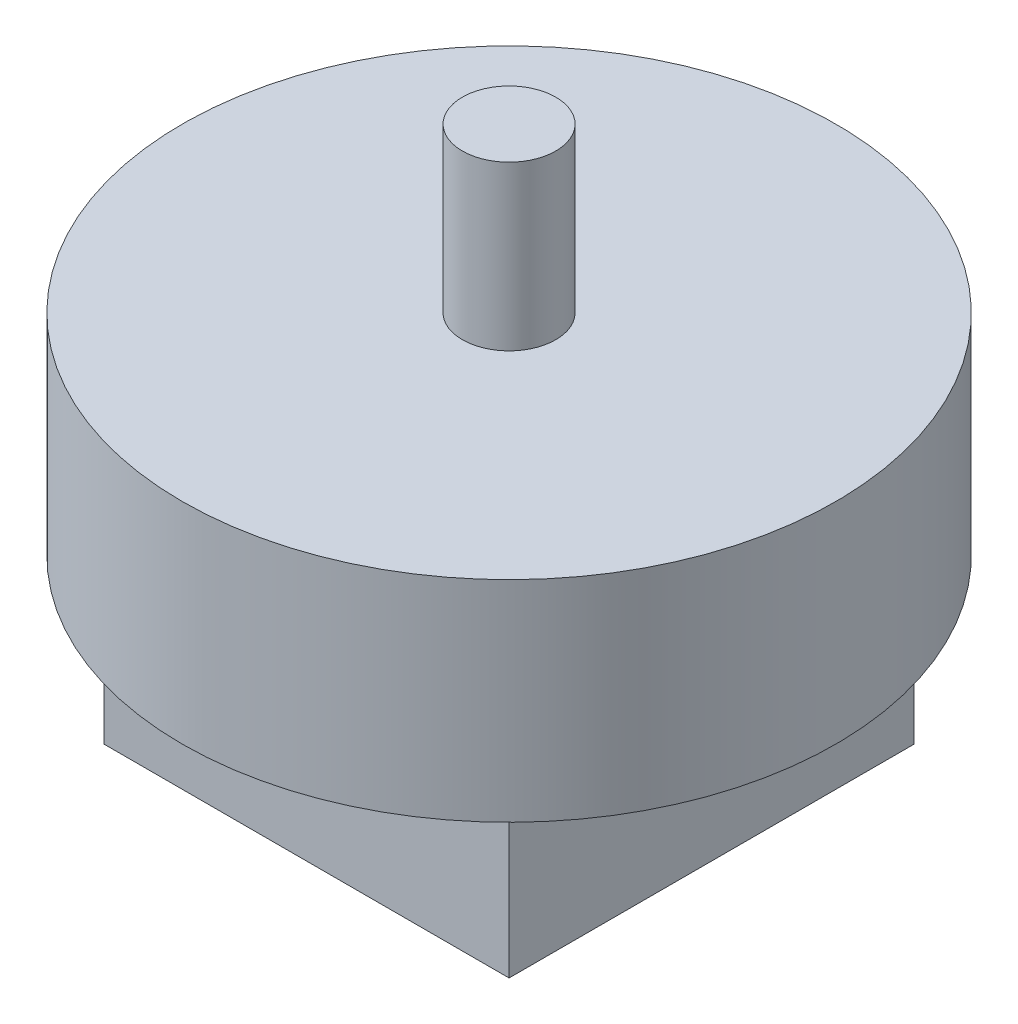
ISO-10303-21;
HEADER;
FILE_DESCRIPTION(('STEP AP214'),'2;1');
FILE_NAME('part.step','',(''),(''),'','','');
FILE_SCHEMA(('AUTOMOTIVE_DESIGN { 1 0 10303 214 1 1 1 1 }'));
ENDSEC;
DATA;
#1=APPLICATION_CONTEXT('core data for automotive mechanical design processes');
#2=APPLICATION_PROTOCOL_DEFINITION('international standard','automotive_design',2000,#1);
#3=PRODUCT_CONTEXT('',#1,'mechanical');
#4=PRODUCT('Part','Part','',(#3));
#5=PRODUCT_RELATED_PRODUCT_CATEGORY('part','',(#4));
#6=PRODUCT_DEFINITION_FORMATION('','',#4);
#7=PRODUCT_DEFINITION_CONTEXT('part definition',#1,'design');
#8=PRODUCT_DEFINITION('design','',#6,#7);
#9=PRODUCT_DEFINITION_SHAPE('','',#8);
#10=(LENGTH_UNIT() NAMED_UNIT(*) SI_UNIT(.MILLI.,.METRE.));
#11=(NAMED_UNIT(*) PLANE_ANGLE_UNIT() SI_UNIT($,.RADIAN.));
#12=(NAMED_UNIT(*) SI_UNIT($,.STERADIAN.) SOLID_ANGLE_UNIT());
#13=UNCERTAINTY_MEASURE_WITH_UNIT(LENGTH_MEASURE(1.E-05),#10,'distance_accuracy_value','');
#14=(GEOMETRIC_REPRESENTATION_CONTEXT(3) GLOBAL_UNCERTAINTY_ASSIGNED_CONTEXT((#13)) GLOBAL_UNIT_ASSIGNED_CONTEXT((#10,
#11,#12)) REPRESENTATION_CONTEXT('',''));
#15=CARTESIAN_POINT('',(0.,0.,0.));
#16=DIRECTION('',(0.,0.,1.));
#17=DIRECTION('',(1.,0.,0.));
#18=AXIS2_PLACEMENT_3D('',#15,#16,#17);
#19=CARTESIAN_POINT('',(0.,0.,0.));
#20=DIRECTION('',(0.,1.,0.));
#21=DIRECTION('',(0.,0.,1.));
#22=AXIS2_PLACEMENT_3D('',#19,#20,#21);
#23=PLANE('',#22);
#24=CARTESIAN_POINT('',(0.,0.,0.));
#25=DIRECTION('',(0.,1.,0.));
#26=DIRECTION('',(0.,0.,1.));
#27=AXIS2_PLACEMENT_3D('',#24,#25,#26);
#28=CIRCLE('',#27,14.);
#29=CARTESIAN_POINT('',(0.,0.,14.));
#30=VERTEX_POINT('',#29);
#31=EDGE_CURVE('E49',#30,#30,#28,.T.);
#32=ORIENTED_EDGE('',*,*,#31,.F.);
#33=EDGE_LOOP('',(#32));
#34=FACE_BOUND('',#33,.T.);
#35=DIRECTION('',(0.,0.,1.));
#36=VECTOR('',#35,1.);
#37=CARTESIAN_POINT('',(8.675,0.,8.675));
#38=LINE('',#37,#36);
#39=CARTESIAN_POINT('',(8.675,0.,-8.675));
#40=VERTEX_POINT('',#39);
#41=CARTESIAN_POINT('',(8.675,0.,8.675));
#42=VERTEX_POINT('',#41);
#43=EDGE_CURVE('E61',#40,#42,#38,.T.);
#44=ORIENTED_EDGE('',*,*,#43,.F.);
#45=DIRECTION('',(1.,0.,0.));
#46=VECTOR('',#45,1.);
#47=CARTESIAN_POINT('',(-8.675,0.,-8.675));
#48=LINE('',#47,#46);
#49=CARTESIAN_POINT('',(-8.675,0.,-8.675));
#50=VERTEX_POINT('',#49);
#51=EDGE_CURVE('E65',#50,#40,#48,.T.);
#52=ORIENTED_EDGE('',*,*,#51,.F.);
#53=DIRECTION('',(0.,0.,-1.));
#54=VECTOR('',#53,1.);
#55=CARTESIAN_POINT('',(-8.675,0.,8.675));
#56=LINE('',#55,#54);
#57=CARTESIAN_POINT('',(-8.675,0.,8.675));
#58=VERTEX_POINT('',#57);
#59=EDGE_CURVE('E125',#58,#50,#56,.T.);
#60=ORIENTED_EDGE('',*,*,#59,.F.);
#61=DIRECTION('',(-1.,0.,0.));
#62=VECTOR('',#61,1.);
#63=CARTESIAN_POINT('',(-8.675,0.,8.675));
#64=LINE('',#63,#62);
#65=EDGE_CURVE('E128',#42,#58,#64,.T.);
#66=ORIENTED_EDGE('',*,*,#65,.F.);
#67=EDGE_LOOP('',(#44,#52,#60,#66));
#68=FACE_BOUND('',#67,.T.);
#69=ADVANCED_FACE('F45',(#34,#68),#23,.F.);
#70=CARTESIAN_POINT('',(0.,9.,0.));
#71=DIRECTION('',(0.,-1.,0.));
#72=DIRECTION('',(0.,0.,-1.));
#73=AXIS2_PLACEMENT_3D('',#70,#71,#72);
#74=CYLINDRICAL_SURFACE('',#73,14.);
#75=CARTESIAN_POINT('',(0.,9.,0.));
#76=DIRECTION('',(0.,1.,0.));
#77=DIRECTION('',(0.,0.,1.));
#78=AXIS2_PLACEMENT_3D('',#75,#76,#77);
#79=CIRCLE('',#78,14.);
#80=CARTESIAN_POINT('',(0.,9.,14.));
#81=VERTEX_POINT('',#80);
#82=EDGE_CURVE('E11',#81,#81,#79,.T.);
#83=ORIENTED_EDGE('',*,*,#82,.F.);
#84=EDGE_LOOP('',(#83));
#85=FACE_BOUND('',#84,.T.);
#86=ORIENTED_EDGE('',*,*,#31,.T.);
#87=EDGE_LOOP('',(#86));
#88=FACE_BOUND('',#87,.T.);
#89=ADVANCED_FACE('F47',(#85,#88),#74,.T.);
#90=CARTESIAN_POINT('',(0.,9.,0.));
#91=DIRECTION('',(0.,1.,0.));
#92=DIRECTION('',(0.,0.,1.));
#93=AXIS2_PLACEMENT_3D('',#90,#91,#92);
#94=PLANE('',#93);
#95=CARTESIAN_POINT('',(0.,9.,0.));
#96=DIRECTION('',(0.,1.,0.));
#97=DIRECTION('',(0.,0.,1.));
#98=AXIS2_PLACEMENT_3D('',#95,#96,#97);
#99=CIRCLE('',#98,2.);
#100=CARTESIAN_POINT('',(0.,9.,2.));
#101=VERTEX_POINT('',#100);
#102=EDGE_CURVE('E170',#101,#101,#99,.T.);
#103=ORIENTED_EDGE('',*,*,#102,.F.);
#104=EDGE_LOOP('',(#103));
#105=FACE_BOUND('',#104,.T.);
#106=ORIENTED_EDGE('',*,*,#82,.T.);
#107=EDGE_LOOP('',(#106));
#108=FACE_BOUND('',#107,.T.);
#109=ADVANCED_FACE('F187',(#105,#108),#94,.T.);
#110=CARTESIAN_POINT('',(8.675,-7.,8.675));
#111=DIRECTION('',(-1.,0.,0.));
#112=DIRECTION('',(0.,0.,1.));
#113=AXIS2_PLACEMENT_3D('',#110,#111,#112);
#114=PLANE('',#113);
#115=ORIENTED_EDGE('',*,*,#43,.T.);
#116=DIRECTION('',(0.,1.,0.));
#117=VECTOR('',#116,1.);
#118=CARTESIAN_POINT('',(8.675,-7.,8.675));
#119=LINE('',#118,#117);
#120=CARTESIAN_POINT('',(8.675,-7.,8.675));
#121=VERTEX_POINT('',#120);
#122=EDGE_CURVE('E90',#121,#42,#119,.T.);
#123=ORIENTED_EDGE('',*,*,#122,.F.);
#124=DIRECTION('',(0.,0.,1.));
#125=VECTOR('',#124,1.);
#126=CARTESIAN_POINT('',(8.675,-7.,8.675));
#127=LINE('',#126,#125);
#128=CARTESIAN_POINT('',(8.675,-7.,-8.675));
#129=VERTEX_POINT('',#128);
#130=EDGE_CURVE('E97',#129,#121,#127,.T.);
#131=ORIENTED_EDGE('',*,*,#130,.F.);
#132=DIRECTION('',(0.,1.,0.));
#133=VECTOR('',#132,1.);
#134=CARTESIAN_POINT('',(8.675,-7.,-8.675));
#135=LINE('',#134,#133);
#136=EDGE_CURVE('E120',#129,#40,#135,.T.);
#137=ORIENTED_EDGE('',*,*,#136,.T.);
#138=EDGE_LOOP('',(#115,#123,#131,#137));
#139=FACE_BOUND('',#138,.T.);
#140=ADVANCED_FACE('F108',(#139),#114,.F.);
#141=CARTESIAN_POINT('',(-8.675,-7.,8.675));
#142=DIRECTION('',(0.,0.,-1.));
#143=DIRECTION('',(-1.,0.,0.));
#144=AXIS2_PLACEMENT_3D('',#141,#142,#143);
#145=PLANE('',#144);
#146=ORIENTED_EDGE('',*,*,#65,.T.);
#147=DIRECTION('',(0.,1.,0.));
#148=VECTOR('',#147,1.);
#149=CARTESIAN_POINT('',(-8.675,-7.,8.675));
#150=LINE('',#149,#148);
#151=CARTESIAN_POINT('',(-8.675,-7.,8.675));
#152=VERTEX_POINT('',#151);
#153=EDGE_CURVE('E92',#152,#58,#150,.T.);
#154=ORIENTED_EDGE('',*,*,#153,.F.);
#155=DIRECTION('',(-1.,0.,0.));
#156=VECTOR('',#155,1.);
#157=CARTESIAN_POINT('',(-8.675,-7.,8.675));
#158=LINE('',#157,#156);
#159=EDGE_CURVE('E85',#121,#152,#158,.T.);
#160=ORIENTED_EDGE('',*,*,#159,.F.);
#161=ORIENTED_EDGE('',*,*,#122,.T.);
#162=EDGE_LOOP('',(#146,#154,#160,#161));
#163=FACE_BOUND('',#162,.T.);
#164=ADVANCED_FACE('F88',(#163),#145,.F.);
#165=CARTESIAN_POINT('',(-8.675,-7.,8.675));
#166=DIRECTION('',(1.,0.,0.));
#167=DIRECTION('',(0.,0.,-1.));
#168=AXIS2_PLACEMENT_3D('',#165,#166,#167);
#169=PLANE('',#168);
#170=ORIENTED_EDGE('',*,*,#59,.T.);
#171=DIRECTION('',(0.,1.,0.));
#172=VECTOR('',#171,1.);
#173=CARTESIAN_POINT('',(-8.675,-7.,-8.675));
#174=LINE('',#173,#172);
#175=CARTESIAN_POINT('',(-8.675,-7.,-8.675));
#176=VERTEX_POINT('',#175);
#177=EDGE_CURVE('E114',#176,#50,#174,.T.);
#178=ORIENTED_EDGE('',*,*,#177,.F.);
#179=DIRECTION('',(0.,0.,-1.));
#180=VECTOR('',#179,1.);
#181=CARTESIAN_POINT('',(-8.675,-7.,8.675));
#182=LINE('',#181,#180);
#183=EDGE_CURVE('E96',#152,#176,#182,.T.);
#184=ORIENTED_EDGE('',*,*,#183,.F.);
#185=ORIENTED_EDGE('',*,*,#153,.T.);
#186=EDGE_LOOP('',(#170,#178,#184,#185));
#187=FACE_BOUND('',#186,.T.);
#188=ADVANCED_FACE('F205',(#187),#169,.F.);
#189=CARTESIAN_POINT('',(-8.675,-7.,-8.675));
#190=DIRECTION('',(0.,0.,1.));
#191=DIRECTION('',(1.,0.,0.));
#192=AXIS2_PLACEMENT_3D('',#189,#190,#191);
#193=PLANE('',#192);
#194=ORIENTED_EDGE('',*,*,#51,.T.);
#195=ORIENTED_EDGE('',*,*,#136,.F.);
#196=DIRECTION('',(1.,0.,0.));
#197=VECTOR('',#196,1.);
#198=CARTESIAN_POINT('',(-8.675,-7.,-8.675));
#199=LINE('',#198,#197);
#200=EDGE_CURVE('E102',#176,#129,#199,.T.);
#201=ORIENTED_EDGE('',*,*,#200,.F.);
#202=ORIENTED_EDGE('',*,*,#177,.T.);
#203=EDGE_LOOP('',(#194,#195,#201,#202));
#204=FACE_BOUND('',#203,.T.);
#205=ADVANCED_FACE('F208',(#204),#193,.F.);
#206=CARTESIAN_POINT('',(0.,-7.,0.));
#207=DIRECTION('',(0.,-1.,0.));
#208=DIRECTION('',(0.,0.,-1.));
#209=AXIS2_PLACEMENT_3D('',#206,#207,#208);
#210=PLANE('',#209);
#211=CARTESIAN_POINT('',(5.675,-7.,5.675));
#212=DIRECTION('',(0.,-1.,0.));
#213=DIRECTION('',(0.,0.,-1.));
#214=AXIS2_PLACEMENT_3D('',#211,#212,#213);
#215=CIRCLE('',#214,1.7);
#216=CARTESIAN_POINT('',(5.675,-7.,3.975));
#217=VERTEX_POINT('',#216);
#218=EDGE_CURVE('E150',#217,#217,#215,.T.);
#219=ORIENTED_EDGE('',*,*,#218,.F.);
#220=EDGE_LOOP('',(#219));
#221=FACE_BOUND('',#220,.T.);
#222=CARTESIAN_POINT('',(5.675,-7.,-5.31644452063213));
#223=DIRECTION('',(0.,-1.,0.));
#224=DIRECTION('',(0.,0.,-1.));
#225=AXIS2_PLACEMENT_3D('',#222,#223,#224);
#226=CIRCLE('',#225,1.7);
#227=CARTESIAN_POINT('',(5.675,-7.,-7.01644452063213));
#228=VERTEX_POINT('',#227);
#229=EDGE_CURVE('E159',#228,#228,#226,.T.);
#230=ORIENTED_EDGE('',*,*,#229,.F.);
#231=EDGE_LOOP('',(#230));
#232=FACE_BOUND('',#231,.T.);
#233=CARTESIAN_POINT('',(-5.95204379237758,-7.,-5.31644452063213));
#234=DIRECTION('',(0.,-1.,0.));
#235=DIRECTION('',(0.,0.,-1.));
#236=AXIS2_PLACEMENT_3D('',#233,#234,#235);
#237=CIRCLE('',#236,1.7);
#238=CARTESIAN_POINT('',(-5.95204379237758,-7.,-7.01644452063213));
#239=VERTEX_POINT('',#238);
#240=EDGE_CURVE('E142',#239,#239,#237,.T.);
#241=ORIENTED_EDGE('',*,*,#240,.F.);
#242=EDGE_LOOP('',(#241));
#243=FACE_BOUND('',#242,.T.);
#244=CARTESIAN_POINT('',(-5.95204379237758,-7.,5.675));
#245=DIRECTION('',(0.,-1.,0.));
#246=DIRECTION('',(0.,0.,-1.));
#247=AXIS2_PLACEMENT_3D('',#244,#245,#246);
#248=CIRCLE('',#247,1.7);
#249=CARTESIAN_POINT('',(-5.95204379237758,-7.,3.975));
#250=VERTEX_POINT('',#249);
#251=EDGE_CURVE('E138',#250,#250,#248,.T.);
#252=ORIENTED_EDGE('',*,*,#251,.F.);
#253=EDGE_LOOP('',(#252));
#254=FACE_BOUND('',#253,.T.);
#255=ORIENTED_EDGE('',*,*,#130,.T.);
#256=ORIENTED_EDGE('',*,*,#159,.T.);
#257=ORIENTED_EDGE('',*,*,#183,.T.);
#258=ORIENTED_EDGE('',*,*,#200,.T.);
#259=EDGE_LOOP('',(#255,#256,#257,#258));
#260=FACE_BOUND('',#259,.T.);
#261=ADVANCED_FACE('F100',(#221,#232,#243,#254,#260),#210,.T.);
#262=CARTESIAN_POINT('',(-5.95204379237758,0.,5.675));
#263=DIRECTION('',(0.,-1.,0.));
#264=DIRECTION('',(0.,0.,-1.));
#265=AXIS2_PLACEMENT_3D('',#262,#263,#264);
#266=CYLINDRICAL_SURFACE('',#265,1.7);
#267=CARTESIAN_POINT('',(-5.95204379237758,0.,5.675));
#268=DIRECTION('',(0.,-1.,0.));
#269=DIRECTION('',(0.,0.,-1.));
#270=AXIS2_PLACEMENT_3D('',#267,#268,#269);
#271=CIRCLE('',#270,1.7);
#272=CARTESIAN_POINT('',(-5.95204379237758,0.,3.975));
#273=VERTEX_POINT('',#272);
#274=EDGE_CURVE('E133',#273,#273,#271,.T.);
#275=ORIENTED_EDGE('',*,*,#274,.F.);
#276=EDGE_LOOP('',(#275));
#277=FACE_BOUND('',#276,.T.);
#278=ORIENTED_EDGE('',*,*,#251,.T.);
#279=EDGE_LOOP('',(#278));
#280=FACE_BOUND('',#279,.T.);
#281=ADVANCED_FACE('F215',(#277,#280),#266,.F.);
#282=CARTESIAN_POINT('',(-5.95204379237758,0.,5.675));
#283=DIRECTION('',(0.,-1.,0.));
#284=DIRECTION('',(0.,0.,-1.));
#285=AXIS2_PLACEMENT_3D('',#282,#283,#284);
#286=PLANE('',#285);
#287=ORIENTED_EDGE('',*,*,#274,.T.);
#288=EDGE_LOOP('',(#287));
#289=FACE_BOUND('',#288,.T.);
#290=ADVANCED_FACE('F219',(#289),#286,.T.);
#291=CARTESIAN_POINT('',(-5.95204379237758,0.,-5.31644452063213));
#292=DIRECTION('',(0.,-1.,0.));
#293=DIRECTION('',(0.,0.,-1.));
#294=AXIS2_PLACEMENT_3D('',#291,#292,#293);
#295=CYLINDRICAL_SURFACE('',#294,1.7);
#296=CARTESIAN_POINT('',(-5.95204379237758,0.,-5.31644452063213));
#297=DIRECTION('',(0.,-1.,0.));
#298=DIRECTION('',(0.,0.,-1.));
#299=AXIS2_PLACEMENT_3D('',#296,#297,#298);
#300=CIRCLE('',#299,1.7);
#301=CARTESIAN_POINT('',(-5.95204379237758,0.,-7.01644452063213));
#302=VERTEX_POINT('',#301);
#303=EDGE_CURVE('E163',#302,#302,#300,.T.);
#304=ORIENTED_EDGE('',*,*,#303,.F.);
#305=EDGE_LOOP('',(#304));
#306=FACE_BOUND('',#305,.T.);
#307=ORIENTED_EDGE('',*,*,#240,.T.);
#308=EDGE_LOOP('',(#307));
#309=FACE_BOUND('',#308,.T.);
#310=ADVANCED_FACE('F223',(#306,#309),#295,.F.);
#311=CARTESIAN_POINT('',(-5.95204379237758,0.,-5.31644452063213));
#312=DIRECTION('',(0.,-1.,0.));
#313=DIRECTION('',(0.,0.,-1.));
#314=AXIS2_PLACEMENT_3D('',#311,#312,#313);
#315=PLANE('',#314);
#316=ORIENTED_EDGE('',*,*,#303,.T.);
#317=EDGE_LOOP('',(#316));
#318=FACE_BOUND('',#317,.T.);
#319=ADVANCED_FACE('F239',(#318),#315,.T.);
#320=CARTESIAN_POINT('',(5.675,0.,-5.31644452063213));
#321=DIRECTION('',(0.,-1.,0.));
#322=DIRECTION('',(0.,0.,-1.));
#323=AXIS2_PLACEMENT_3D('',#320,#321,#322);
#324=CYLINDRICAL_SURFACE('',#323,1.7);
#325=CARTESIAN_POINT('',(5.675,0.,-5.31644452063213));
#326=DIRECTION('',(0.,-1.,0.));
#327=DIRECTION('',(0.,0.,-1.));
#328=AXIS2_PLACEMENT_3D('',#325,#326,#327);
#329=CIRCLE('',#328,1.7);
#330=CARTESIAN_POINT('',(5.675,0.,-7.01644452063213));
#331=VERTEX_POINT('',#330);
#332=EDGE_CURVE('E155',#331,#331,#329,.T.);
#333=ORIENTED_EDGE('',*,*,#332,.F.);
#334=EDGE_LOOP('',(#333));
#335=FACE_BOUND('',#334,.T.);
#336=ORIENTED_EDGE('',*,*,#229,.T.);
#337=EDGE_LOOP('',(#336));
#338=FACE_BOUND('',#337,.T.);
#339=ADVANCED_FACE('F235',(#335,#338),#324,.F.);
#340=CARTESIAN_POINT('',(5.675,0.,-5.31644452063213));
#341=DIRECTION('',(0.,-1.,0.));
#342=DIRECTION('',(0.,0.,-1.));
#343=AXIS2_PLACEMENT_3D('',#340,#341,#342);
#344=PLANE('',#343);
#345=ORIENTED_EDGE('',*,*,#332,.T.);
#346=EDGE_LOOP('',(#345));
#347=FACE_BOUND('',#346,.T.);
#348=ADVANCED_FACE('F231',(#347),#344,.T.);
#349=CARTESIAN_POINT('',(5.675,0.,5.675));
#350=DIRECTION('',(0.,-1.,0.));
#351=DIRECTION('',(0.,0.,-1.));
#352=AXIS2_PLACEMENT_3D('',#349,#350,#351);
#353=CYLINDRICAL_SURFACE('',#352,1.7);
#354=CARTESIAN_POINT('',(5.675,0.,5.675));
#355=DIRECTION('',(0.,-1.,0.));
#356=DIRECTION('',(0.,0.,-1.));
#357=AXIS2_PLACEMENT_3D('',#354,#355,#356);
#358=CIRCLE('',#357,1.7);
#359=CARTESIAN_POINT('',(5.675,0.,3.975));
#360=VERTEX_POINT('',#359);
#361=EDGE_CURVE('E146',#360,#360,#358,.T.);
#362=ORIENTED_EDGE('',*,*,#361,.F.);
#363=EDGE_LOOP('',(#362));
#364=FACE_BOUND('',#363,.T.);
#365=ORIENTED_EDGE('',*,*,#218,.T.);
#366=EDGE_LOOP('',(#365));
#367=FACE_BOUND('',#366,.T.);
#368=ADVANCED_FACE('F227',(#364,#367),#353,.F.);
#369=CARTESIAN_POINT('',(5.675,0.,5.675));
#370=DIRECTION('',(0.,-1.,0.));
#371=DIRECTION('',(0.,0.,-1.));
#372=AXIS2_PLACEMENT_3D('',#369,#370,#371);
#373=PLANE('',#372);
#374=ORIENTED_EDGE('',*,*,#361,.T.);
#375=EDGE_LOOP('',(#374));
#376=FACE_BOUND('',#375,.T.);
#377=ADVANCED_FACE('F183',(#376),#373,.T.);
#378=CARTESIAN_POINT('',(0.,16.,0.));
#379=DIRECTION('',(0.,-1.,0.));
#380=DIRECTION('',(0.,0.,-1.));
#381=AXIS2_PLACEMENT_3D('',#378,#379,#380);
#382=CYLINDRICAL_SURFACE('',#381,2.);
#383=CARTESIAN_POINT('',(0.,16.,0.));
#384=DIRECTION('',(0.,1.,0.));
#385=DIRECTION('',(0.,0.,1.));
#386=AXIS2_PLACEMENT_3D('',#383,#384,#385);
#387=CIRCLE('',#386,2.);
#388=CARTESIAN_POINT('',(0.,16.,2.));
#389=VERTEX_POINT('',#388);
#390=EDGE_CURVE('E151',#389,#389,#387,.T.);
#391=ORIENTED_EDGE('',*,*,#390,.F.);
#392=EDGE_LOOP('',(#391));
#393=FACE_BOUND('',#392,.T.);
#394=ORIENTED_EDGE('',*,*,#102,.T.);
#395=EDGE_LOOP('',(#394));
#396=FACE_BOUND('',#395,.T.);
#397=ADVANCED_FACE('F180',(#393,#396),#382,.T.);
#398=CARTESIAN_POINT('',(0.,16.,0.));
#399=DIRECTION('',(0.,1.,0.));
#400=DIRECTION('',(0.,0.,1.));
#401=AXIS2_PLACEMENT_3D('',#398,#399,#400);
#402=PLANE('',#401);
#403=ORIENTED_EDGE('',*,*,#390,.T.);
#404=EDGE_LOOP('',(#403));
#405=FACE_BOUND('',#404,.T.);
#406=ADVANCED_FACE('F178',(#405),#402,.T.);
#407=CLOSED_SHELL('',(#69,#89,#109,#140,#164,#188,#205,#261,#281,#290,#310,#319,#339,#348,#368,
#377,#397,#406));
#408=MANIFOLD_SOLID_BREP('B2',#407);
#409=ADVANCED_BREP_SHAPE_REPRESENTATION('',(#18,#408),#14);
#410=SHAPE_DEFINITION_REPRESENTATION(#9,#409);
ENDSEC;
END-ISO-10303-21;
